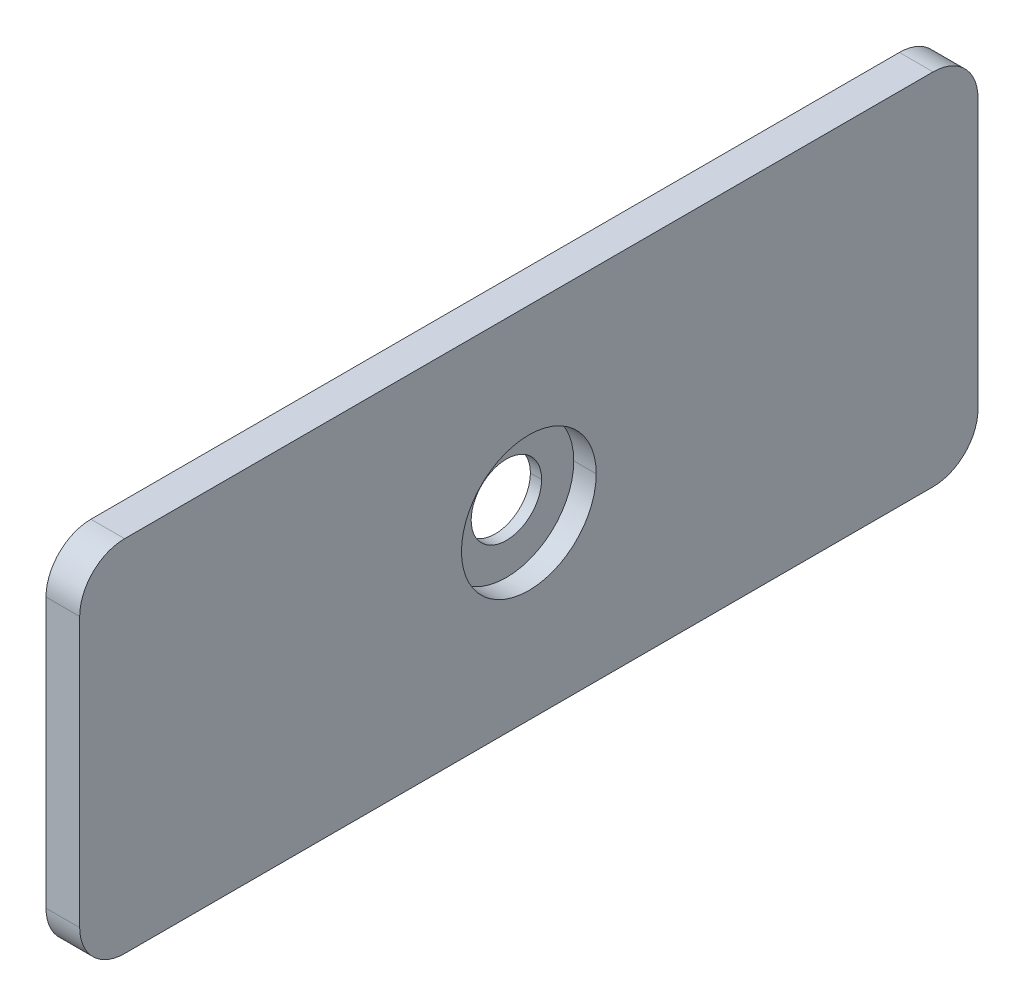
ISO-10303-21;
HEADER;
FILE_DESCRIPTION(('STEP AP214'),'2;1');
FILE_NAME('part.step','',(''),(''),'','','');
FILE_SCHEMA(('AUTOMOTIVE_DESIGN { 1 0 10303 214 1 1 1 1 }'));
ENDSEC;
DATA;
#1=APPLICATION_CONTEXT('core data for automotive mechanical design processes');
#2=APPLICATION_PROTOCOL_DEFINITION('international standard','automotive_design',2000,#1);
#3=PRODUCT_CONTEXT('',#1,'mechanical');
#4=PRODUCT('Part','Part','',(#3));
#5=PRODUCT_RELATED_PRODUCT_CATEGORY('part','',(#4));
#6=PRODUCT_DEFINITION_FORMATION('','',#4);
#7=PRODUCT_DEFINITION_CONTEXT('part definition',#1,'design');
#8=PRODUCT_DEFINITION('design','',#6,#7);
#9=PRODUCT_DEFINITION_SHAPE('','',#8);
#10=(LENGTH_UNIT() NAMED_UNIT(*) SI_UNIT(.MILLI.,.METRE.));
#11=(NAMED_UNIT(*) PLANE_ANGLE_UNIT() SI_UNIT($,.RADIAN.));
#12=(NAMED_UNIT(*) SI_UNIT($,.STERADIAN.) SOLID_ANGLE_UNIT());
#13=UNCERTAINTY_MEASURE_WITH_UNIT(LENGTH_MEASURE(1.E-05),#10,'distance_accuracy_value','');
#14=(GEOMETRIC_REPRESENTATION_CONTEXT(3) GLOBAL_UNCERTAINTY_ASSIGNED_CONTEXT((#13)) GLOBAL_UNIT_ASSIGNED_CONTEXT((#10,
#11,#12)) REPRESENTATION_CONTEXT('',''));
#15=CARTESIAN_POINT('',(0.,0.,0.));
#16=DIRECTION('',(0.,0.,1.));
#17=DIRECTION('',(1.,0.,0.));
#18=AXIS2_PLACEMENT_3D('',#15,#16,#17);
#19=CARTESIAN_POINT('',(-0.396875,0.,0.));
#20=DIRECTION('',(1.,0.,0.));
#21=DIRECTION('',(0.,0.,-1.));
#22=AXIS2_PLACEMENT_3D('',#19,#20,#21);
#23=CYLINDRICAL_SURFACE('',#22,4.7625);
#24=DIRECTION('',(1.,0.,0.));
#25=VECTOR('',#24,1.);
#26=CARTESIAN_POINT('',(-0.396875,0.,4.7625));
#27=LINE('',#26,#25);
#28=CARTESIAN_POINT('',(-0.396875,0.,4.7625));
#29=VERTEX_POINT('',#28);
#30=CARTESIAN_POINT('',(1.190625,0.,4.7625));
#31=VERTEX_POINT('',#30);
#32=EDGE_CURVE('E231',#29,#31,#27,.T.);
#33=ORIENTED_EDGE('',*,*,#32,.F.);
#34=CARTESIAN_POINT('',(-0.396875,0.,0.));
#35=DIRECTION('',(1.,0.,0.));
#36=DIRECTION('',(0.,0.,-1.));
#37=AXIS2_PLACEMENT_3D('',#34,#35,#36);
#38=CIRCLE('',#37,4.7625);
#39=CARTESIAN_POINT('',(-0.396875,0.,-4.7625));
#40=VERTEX_POINT('',#39);
#41=EDGE_CURVE('E10',#40,#29,#38,.T.);
#42=ORIENTED_EDGE('',*,*,#41,.F.);
#43=DIRECTION('',(1.,0.,0.));
#44=VECTOR('',#43,1.);
#45=CARTESIAN_POINT('',(-0.396875,0.,-4.7625));
#46=LINE('',#45,#44);
#47=CARTESIAN_POINT('',(1.190625,0.,-4.7625));
#48=VERTEX_POINT('',#47);
#49=EDGE_CURVE('E230',#40,#48,#46,.T.);
#50=ORIENTED_EDGE('',*,*,#49,.T.);
#51=CARTESIAN_POINT('',(1.190625,0.,0.));
#52=DIRECTION('',(1.,0.,0.));
#53=DIRECTION('',(0.,0.,-1.));
#54=AXIS2_PLACEMENT_3D('',#51,#52,#53);
#55=CIRCLE('',#54,4.7625);
#56=EDGE_CURVE('E180',#48,#31,#55,.T.);
#57=ORIENTED_EDGE('',*,*,#56,.T.);
#58=EDGE_LOOP('',(#33,#42,#50,#57));
#59=FACE_BOUND('',#58,.T.);
#60=ADVANCED_FACE('F15',(#59),#23,.F.);
#61=CARTESIAN_POINT('',(-0.396875,0.,0.));
#62=DIRECTION('',(1.,0.,0.));
#63=DIRECTION('',(0.,1.,0.));
#64=AXIS2_PLACEMENT_3D('',#61,#62,#63);
#65=PLANE('',#64);
#66=CARTESIAN_POINT('',(-0.396875,0.,0.));
#67=DIRECTION('',(-1.,0.,0.));
#68=DIRECTION('',(0.,0.,-1.));
#69=AXIS2_PLACEMENT_3D('',#66,#67,#68);
#70=CIRCLE('',#69,2.4892);
#71=CARTESIAN_POINT('',(-0.396875,0.,-2.4892));
#72=VERTEX_POINT('',#71);
#73=CARTESIAN_POINT('',(-0.396875,0.,2.4892));
#74=VERTEX_POINT('',#73);
#75=EDGE_CURVE('E206',#72,#74,#70,.T.);
#76=ORIENTED_EDGE('',*,*,#75,.T.);
#77=CARTESIAN_POINT('',(-0.396875,0.,0.));
#78=DIRECTION('',(-1.,0.,0.));
#79=DIRECTION('',(0.,0.,-1.));
#80=AXIS2_PLACEMENT_3D('',#77,#78,#79);
#81=CIRCLE('',#80,2.4892);
#82=EDGE_CURVE('E76',#74,#72,#81,.T.);
#83=ORIENTED_EDGE('',*,*,#82,.T.);
#84=EDGE_LOOP('',(#76,#83));
#85=FACE_BOUND('',#84,.T.);
#86=ORIENTED_EDGE('',*,*,#41,.T.);
#87=CARTESIAN_POINT('',(-0.396875,0.,0.));
#88=DIRECTION('',(1.,0.,0.));
#89=DIRECTION('',(0.,0.,-1.));
#90=AXIS2_PLACEMENT_3D('',#87,#88,#89);
#91=CIRCLE('',#90,4.7625);
#92=EDGE_CURVE('E238',#29,#40,#91,.T.);
#93=ORIENTED_EDGE('',*,*,#92,.T.);
#94=EDGE_LOOP('',(#86,#93));
#95=FACE_BOUND('',#94,.T.);
#96=ADVANCED_FACE('F355',(#85,#95),#65,.T.);
#97=CARTESIAN_POINT('',(1.190625,9.525,28.575));
#98=DIRECTION('',(-1.,0.,0.));
#99=DIRECTION('',(0.,0.,1.));
#100=AXIS2_PLACEMENT_3D('',#97,#98,#99);
#101=CYLINDRICAL_SURFACE('',#100,3.175);
#102=CARTESIAN_POINT('',(1.190625,9.525,28.575));
#103=DIRECTION('',(1.,0.,0.));
#104=DIRECTION('',(0.,0.,1.));
#105=AXIS2_PLACEMENT_3D('',#102,#103,#104);
#106=CIRCLE('',#105,3.175);
#107=CARTESIAN_POINT('',(1.190625,12.7,28.575));
#108=VERTEX_POINT('',#107);
#109=CARTESIAN_POINT('',(1.190625,9.525,31.75));
#110=VERTEX_POINT('',#109);
#111=EDGE_CURVE('E141',#108,#110,#106,.T.);
#112=ORIENTED_EDGE('',*,*,#111,.F.);
#113=DIRECTION('',(1.,0.,0.));
#114=VECTOR('',#113,1.);
#115=CARTESIAN_POINT('',(1.190625,12.7,28.575));
#116=LINE('',#115,#114);
#117=CARTESIAN_POINT('',(-1.190625,12.7,28.575));
#118=VERTEX_POINT('',#117);
#119=EDGE_CURVE('E225',#118,#108,#116,.T.);
#120=ORIENTED_EDGE('',*,*,#119,.F.);
#121=CARTESIAN_POINT('',(-1.190625,9.525,28.575));
#122=DIRECTION('',(-1.,0.,0.));
#123=DIRECTION('',(0.,0.,1.));
#124=AXIS2_PLACEMENT_3D('',#121,#122,#123);
#125=CIRCLE('',#124,3.175);
#126=CARTESIAN_POINT('',(-1.190625,9.525,31.75));
#127=VERTEX_POINT('',#126);
#128=EDGE_CURVE('E159',#127,#118,#125,.T.);
#129=ORIENTED_EDGE('',*,*,#128,.F.);
#130=DIRECTION('',(-1.,0.,0.));
#131=VECTOR('',#130,1.);
#132=CARTESIAN_POINT('',(1.190625,9.525,31.75));
#133=LINE('',#132,#131);
#134=EDGE_CURVE('E157',#110,#127,#133,.T.);
#135=ORIENTED_EDGE('',*,*,#134,.F.);
#136=EDGE_LOOP('',(#112,#120,#129,#135));
#137=FACE_BOUND('',#136,.T.);
#138=ADVANCED_FACE('F158',(#137),#101,.T.);
#139=CARTESIAN_POINT('',(1.190625,9.525,-28.575));
#140=DIRECTION('',(-1.,0.,0.));
#141=DIRECTION('',(0.,0.,1.));
#142=AXIS2_PLACEMENT_3D('',#139,#140,#141);
#143=CYLINDRICAL_SURFACE('',#142,3.175);
#144=CARTESIAN_POINT('',(1.190625,9.525,-28.575));
#145=DIRECTION('',(1.,0.,0.));
#146=DIRECTION('',(0.,0.,1.));
#147=AXIS2_PLACEMENT_3D('',#144,#145,#146);
#148=CIRCLE('',#147,3.175);
#149=CARTESIAN_POINT('',(1.190625,9.525,-31.75));
#150=VERTEX_POINT('',#149);
#151=CARTESIAN_POINT('',(1.190625,12.7,-28.575));
#152=VERTEX_POINT('',#151);
#153=EDGE_CURVE('E154',#150,#152,#148,.T.);
#154=ORIENTED_EDGE('',*,*,#153,.F.);
#155=DIRECTION('',(1.,0.,0.));
#156=VECTOR('',#155,1.);
#157=CARTESIAN_POINT('',(1.190625,9.525,-31.75));
#158=LINE('',#157,#156);
#159=CARTESIAN_POINT('',(-1.190625,9.525,-31.75));
#160=VERTEX_POINT('',#159);
#161=EDGE_CURVE('E256',#160,#150,#158,.T.);
#162=ORIENTED_EDGE('',*,*,#161,.F.);
#163=CARTESIAN_POINT('',(-1.190625,9.525,-28.575));
#164=DIRECTION('',(-1.,0.,0.));
#165=DIRECTION('',(0.,0.,1.));
#166=AXIS2_PLACEMENT_3D('',#163,#164,#165);
#167=CIRCLE('',#166,3.175);
#168=CARTESIAN_POINT('',(-1.190625,12.7,-28.575));
#169=VERTEX_POINT('',#168);
#170=EDGE_CURVE('E26',#169,#160,#167,.T.);
#171=ORIENTED_EDGE('',*,*,#170,.F.);
#172=DIRECTION('',(-1.,0.,0.));
#173=VECTOR('',#172,1.);
#174=CARTESIAN_POINT('',(1.190625,12.7,-28.575));
#175=LINE('',#174,#173);
#176=EDGE_CURVE('E217',#152,#169,#175,.T.);
#177=ORIENTED_EDGE('',*,*,#176,.F.);
#178=EDGE_LOOP('',(#154,#162,#171,#177));
#179=FACE_BOUND('',#178,.T.);
#180=ADVANCED_FACE('F305',(#179),#143,.T.);
#181=CARTESIAN_POINT('',(1.190625,-9.525,28.575));
#182=DIRECTION('',(-1.,0.,0.));
#183=DIRECTION('',(0.,0.,1.));
#184=AXIS2_PLACEMENT_3D('',#181,#182,#183);
#185=CYLINDRICAL_SURFACE('',#184,3.175);
#186=CARTESIAN_POINT('',(1.190625,-9.525,28.575));
#187=DIRECTION('',(1.,0.,0.));
#188=DIRECTION('',(0.,0.,1.));
#189=AXIS2_PLACEMENT_3D('',#186,#187,#188);
#190=CIRCLE('',#189,3.175);
#191=CARTESIAN_POINT('',(1.190625,-9.525,31.75));
#192=VERTEX_POINT('',#191);
#193=CARTESIAN_POINT('',(1.190625,-12.7,28.575));
#194=VERTEX_POINT('',#193);
#195=EDGE_CURVE('E41',#192,#194,#190,.T.);
#196=ORIENTED_EDGE('',*,*,#195,.F.);
#197=DIRECTION('',(1.,0.,0.));
#198=VECTOR('',#197,1.);
#199=CARTESIAN_POINT('',(1.190625,-9.525,31.75));
#200=LINE('',#199,#198);
#201=CARTESIAN_POINT('',(-1.190625,-9.525,31.75));
#202=VERTEX_POINT('',#201);
#203=EDGE_CURVE('E167',#202,#192,#200,.T.);
#204=ORIENTED_EDGE('',*,*,#203,.F.);
#205=CARTESIAN_POINT('',(-1.190625,-9.525,28.575));
#206=DIRECTION('',(-1.,0.,0.));
#207=DIRECTION('',(0.,0.,1.));
#208=AXIS2_PLACEMENT_3D('',#205,#206,#207);
#209=CIRCLE('',#208,3.175);
#210=CARTESIAN_POINT('',(-1.190625,-12.7,28.575));
#211=VERTEX_POINT('',#210);
#212=EDGE_CURVE('E133',#211,#202,#209,.T.);
#213=ORIENTED_EDGE('',*,*,#212,.F.);
#214=DIRECTION('',(-1.,0.,0.));
#215=VECTOR('',#214,1.);
#216=CARTESIAN_POINT('',(1.190625,-12.7,28.575));
#217=LINE('',#216,#215);
#218=EDGE_CURVE('E185',#194,#211,#217,.T.);
#219=ORIENTED_EDGE('',*,*,#218,.F.);
#220=EDGE_LOOP('',(#196,#204,#213,#219));
#221=FACE_BOUND('',#220,.T.);
#222=ADVANCED_FACE('F294',(#221),#185,.T.);
#223=CARTESIAN_POINT('',(1.190625,-9.525,-28.575));
#224=DIRECTION('',(-1.,0.,0.));
#225=DIRECTION('',(0.,0.,1.));
#226=AXIS2_PLACEMENT_3D('',#223,#224,#225);
#227=CYLINDRICAL_SURFACE('',#226,3.175);
#228=CARTESIAN_POINT('',(1.190625,-9.525,-28.575));
#229=DIRECTION('',(1.,0.,0.));
#230=DIRECTION('',(0.,0.,1.));
#231=AXIS2_PLACEMENT_3D('',#228,#229,#230);
#232=CIRCLE('',#231,3.175);
#233=CARTESIAN_POINT('',(1.190625,-12.7,-28.575));
#234=VERTEX_POINT('',#233);
#235=CARTESIAN_POINT('',(1.190625,-9.525,-31.75));
#236=VERTEX_POINT('',#235);
#237=EDGE_CURVE('E187',#234,#236,#232,.T.);
#238=ORIENTED_EDGE('',*,*,#237,.F.);
#239=DIRECTION('',(1.,0.,0.));
#240=VECTOR('',#239,1.);
#241=CARTESIAN_POINT('',(1.190625,-12.7,-28.575));
#242=LINE('',#241,#240);
#243=CARTESIAN_POINT('',(-1.190625,-12.7,-28.575));
#244=VERTEX_POINT('',#243);
#245=EDGE_CURVE('E222',#244,#234,#242,.T.);
#246=ORIENTED_EDGE('',*,*,#245,.F.);
#247=CARTESIAN_POINT('',(-1.190625,-9.525,-28.575));
#248=DIRECTION('',(-1.,0.,0.));
#249=DIRECTION('',(0.,0.,1.));
#250=AXIS2_PLACEMENT_3D('',#247,#248,#249);
#251=CIRCLE('',#250,3.175);
#252=CARTESIAN_POINT('',(-1.190625,-9.525,-31.75));
#253=VERTEX_POINT('',#252);
#254=EDGE_CURVE('E182',#253,#244,#251,.T.);
#255=ORIENTED_EDGE('',*,*,#254,.F.);
#256=DIRECTION('',(-1.,0.,0.));
#257=VECTOR('',#256,1.);
#258=CARTESIAN_POINT('',(1.190625,-9.525,-31.75));
#259=LINE('',#258,#257);
#260=EDGE_CURVE('E196',#236,#253,#259,.T.);
#261=ORIENTED_EDGE('',*,*,#260,.F.);
#262=EDGE_LOOP('',(#238,#246,#255,#261));
#263=FACE_BOUND('',#262,.T.);
#264=ADVANCED_FACE('F302',(#263),#227,.T.);
#265=CARTESIAN_POINT('',(-1.190625,0.,0.));
#266=DIRECTION('',(-1.,0.,0.));
#267=DIRECTION('',(0.,0.,1.));
#268=AXIS2_PLACEMENT_3D('',#265,#266,#267);
#269=PLANE('',#268);
#270=CARTESIAN_POINT('',(-1.190625,0.,0.));
#271=DIRECTION('',(1.,0.,0.));
#272=DIRECTION('',(0.,0.,-1.));
#273=AXIS2_PLACEMENT_3D('',#270,#271,#272);
#274=CIRCLE('',#273,2.4892);
#275=CARTESIAN_POINT('',(-1.190625,0.,-2.4892));
#276=VERTEX_POINT('',#275);
#277=CARTESIAN_POINT('',(-1.190625,0.,2.4892));
#278=VERTEX_POINT('',#277);
#279=EDGE_CURVE('E19',#276,#278,#274,.T.);
#280=ORIENTED_EDGE('',*,*,#279,.T.);
#281=CARTESIAN_POINT('',(-1.190625,0.,0.));
#282=DIRECTION('',(1.,0.,0.));
#283=DIRECTION('',(0.,0.,-1.));
#284=AXIS2_PLACEMENT_3D('',#281,#282,#283);
#285=CIRCLE('',#284,2.4892);
#286=EDGE_CURVE('E247',#278,#276,#285,.T.);
#287=ORIENTED_EDGE('',*,*,#286,.T.);
#288=EDGE_LOOP('',(#280,#287));
#289=FACE_BOUND('',#288,.T.);
#290=DIRECTION('',(0.,1.,0.));
#291=VECTOR('',#290,1.);
#292=CARTESIAN_POINT('',(-1.190625,-12.7,-31.75));
#293=LINE('',#292,#291);
#294=EDGE_CURVE('E235',#253,#160,#293,.T.);
#295=ORIENTED_EDGE('',*,*,#294,.F.);
#296=ORIENTED_EDGE('',*,*,#254,.T.);
#297=DIRECTION('',(0.,0.,-1.));
#298=VECTOR('',#297,1.);
#299=CARTESIAN_POINT('',(-1.190625,-12.7,31.75));
#300=LINE('',#299,#298);
#301=EDGE_CURVE('E164',#211,#244,#300,.T.);
#302=ORIENTED_EDGE('',*,*,#301,.F.);
#303=ORIENTED_EDGE('',*,*,#212,.T.);
#304=DIRECTION('',(0.,-1.,0.));
#305=VECTOR('',#304,1.);
#306=CARTESIAN_POINT('',(-1.190625,-12.7,31.75));
#307=LINE('',#306,#305);
#308=EDGE_CURVE('E175',#127,#202,#307,.T.);
#309=ORIENTED_EDGE('',*,*,#308,.F.);
#310=ORIENTED_EDGE('',*,*,#128,.T.);
#311=DIRECTION('',(0.,0.,1.));
#312=VECTOR('',#311,1.);
#313=CARTESIAN_POINT('',(-1.190625,12.7,31.75));
#314=LINE('',#313,#312);
#315=EDGE_CURVE('E179',#169,#118,#314,.T.);
#316=ORIENTED_EDGE('',*,*,#315,.F.);
#317=ORIENTED_EDGE('',*,*,#170,.T.);
#318=EDGE_LOOP('',(#295,#296,#302,#303,#309,#310,#316,#317));
#319=FACE_BOUND('',#318,.T.);
#320=ADVANCED_FACE('F291',(#289,#319),#269,.T.);
#321=CARTESIAN_POINT('',(1.190625,0.,0.));
#322=DIRECTION('',(-1.,0.,0.));
#323=DIRECTION('',(0.,0.,1.));
#324=AXIS2_PLACEMENT_3D('',#321,#322,#323);
#325=PLANE('',#324);
#326=ORIENTED_EDGE('',*,*,#56,.F.);
#327=CARTESIAN_POINT('',(1.190625,0.,0.));
#328=DIRECTION('',(1.,0.,0.));
#329=DIRECTION('',(0.,0.,-1.));
#330=AXIS2_PLACEMENT_3D('',#327,#328,#329);
#331=CIRCLE('',#330,4.7625);
#332=EDGE_CURVE('E226',#31,#48,#331,.T.);
#333=ORIENTED_EDGE('',*,*,#332,.F.);
#334=EDGE_LOOP('',(#326,#333));
#335=FACE_BOUND('',#334,.T.);
#336=DIRECTION('',(0.,0.,-1.));
#337=VECTOR('',#336,1.);
#338=CARTESIAN_POINT('',(1.190625,-12.7,31.75));
#339=LINE('',#338,#337);
#340=EDGE_CURVE('E188',#194,#234,#339,.T.);
#341=ORIENTED_EDGE('',*,*,#340,.T.);
#342=ORIENTED_EDGE('',*,*,#237,.T.);
#343=DIRECTION('',(0.,1.,0.));
#344=VECTOR('',#343,1.);
#345=CARTESIAN_POINT('',(1.190625,-12.7,-31.75));
#346=LINE('',#345,#344);
#347=EDGE_CURVE('E190',#236,#150,#346,.T.);
#348=ORIENTED_EDGE('',*,*,#347,.T.);
#349=ORIENTED_EDGE('',*,*,#153,.T.);
#350=DIRECTION('',(0.,0.,1.));
#351=VECTOR('',#350,1.);
#352=CARTESIAN_POINT('',(1.190625,12.7,31.75));
#353=LINE('',#352,#351);
#354=EDGE_CURVE('E149',#152,#108,#353,.T.);
#355=ORIENTED_EDGE('',*,*,#354,.T.);
#356=ORIENTED_EDGE('',*,*,#111,.T.);
#357=DIRECTION('',(0.,-1.,0.));
#358=VECTOR('',#357,1.);
#359=CARTESIAN_POINT('',(1.190625,-12.7,31.75));
#360=LINE('',#359,#358);
#361=EDGE_CURVE('E145',#110,#192,#360,.T.);
#362=ORIENTED_EDGE('',*,*,#361,.T.);
#363=ORIENTED_EDGE('',*,*,#195,.T.);
#364=EDGE_LOOP('',(#341,#342,#348,#349,#355,#356,#362,#363));
#365=FACE_BOUND('',#364,.T.);
#366=ADVANCED_FACE('F143',(#335,#365),#325,.F.);
#367=CARTESIAN_POINT('',(1.190625,-12.7,31.75));
#368=DIRECTION('',(0.,1.,0.));
#369=DIRECTION('',(1.,0.,0.));
#370=AXIS2_PLACEMENT_3D('',#367,#368,#369);
#371=PLANE('',#370);
#372=ORIENTED_EDGE('',*,*,#301,.T.);
#373=ORIENTED_EDGE('',*,*,#245,.T.);
#374=ORIENTED_EDGE('',*,*,#340,.F.);
#375=ORIENTED_EDGE('',*,*,#218,.T.);
#376=EDGE_LOOP('',(#372,#373,#374,#375));
#377=FACE_BOUND('',#376,.T.);
#378=ADVANCED_FACE('F297',(#377),#371,.F.);
#379=CARTESIAN_POINT('',(1.190625,-12.7,31.75));
#380=DIRECTION('',(0.,0.,-1.));
#381=DIRECTION('',(0.,-1.,0.));
#382=AXIS2_PLACEMENT_3D('',#379,#380,#381);
#383=PLANE('',#382);
#384=ORIENTED_EDGE('',*,*,#308,.T.);
#385=ORIENTED_EDGE('',*,*,#203,.T.);
#386=ORIENTED_EDGE('',*,*,#361,.F.);
#387=ORIENTED_EDGE('',*,*,#134,.T.);
#388=EDGE_LOOP('',(#384,#385,#386,#387));
#389=FACE_BOUND('',#388,.T.);
#390=ADVANCED_FACE('F166',(#389),#383,.F.);
#391=CARTESIAN_POINT('',(1.190625,12.7,31.75));
#392=DIRECTION('',(0.,-1.,0.));
#393=DIRECTION('',(0.,0.,-1.));
#394=AXIS2_PLACEMENT_3D('',#391,#392,#393);
#395=PLANE('',#394);
#396=ORIENTED_EDGE('',*,*,#354,.F.);
#397=ORIENTED_EDGE('',*,*,#176,.T.);
#398=ORIENTED_EDGE('',*,*,#315,.T.);
#399=ORIENTED_EDGE('',*,*,#119,.T.);
#400=EDGE_LOOP('',(#396,#397,#398,#399));
#401=FACE_BOUND('',#400,.T.);
#402=ADVANCED_FACE('F287',(#401),#395,.F.);
#403=CARTESIAN_POINT('',(1.190625,-12.7,-31.75));
#404=DIRECTION('',(0.,0.,1.));
#405=DIRECTION('',(1.,0.,0.));
#406=AXIS2_PLACEMENT_3D('',#403,#404,#405);
#407=PLANE('',#406);
#408=ORIENTED_EDGE('',*,*,#347,.F.);
#409=ORIENTED_EDGE('',*,*,#260,.T.);
#410=ORIENTED_EDGE('',*,*,#294,.T.);
#411=ORIENTED_EDGE('',*,*,#161,.T.);
#412=EDGE_LOOP('',(#408,#409,#410,#411));
#413=FACE_BOUND('',#412,.T.);
#414=ADVANCED_FACE('F17',(#413),#407,.F.);
#415=CARTESIAN_POINT('',(-1.190625,0.,0.));
#416=DIRECTION('',(1.,0.,0.));
#417=DIRECTION('',(0.,0.,-1.));
#418=AXIS2_PLACEMENT_3D('',#415,#416,#417);
#419=CYLINDRICAL_SURFACE('',#418,2.4892);
#420=DIRECTION('',(1.,0.,0.));
#421=VECTOR('',#420,1.);
#422=CARTESIAN_POINT('',(-1.190625,0.,2.4892));
#423=LINE('',#422,#421);
#424=EDGE_CURVE('E214',#278,#74,#423,.T.);
#425=ORIENTED_EDGE('',*,*,#424,.F.);
#426=ORIENTED_EDGE('',*,*,#279,.F.);
#427=DIRECTION('',(1.,0.,0.));
#428=VECTOR('',#427,1.);
#429=CARTESIAN_POINT('',(-1.190625,0.,-2.4892));
#430=LINE('',#429,#428);
#431=EDGE_CURVE('E199',#276,#72,#430,.T.);
#432=ORIENTED_EDGE('',*,*,#431,.T.);
#433=ORIENTED_EDGE('',*,*,#82,.F.);
#434=EDGE_LOOP('',(#425,#426,#432,#433));
#435=FACE_BOUND('',#434,.T.);
#436=ADVANCED_FACE('F328',(#435),#419,.F.);
#437=CARTESIAN_POINT('',(-1.190625,0.,0.));
#438=DIRECTION('',(1.,0.,0.));
#439=DIRECTION('',(0.,0.,-1.));
#440=AXIS2_PLACEMENT_3D('',#437,#438,#439);
#441=CYLINDRICAL_SURFACE('',#440,2.4892);
#442=ORIENTED_EDGE('',*,*,#286,.F.);
#443=ORIENTED_EDGE('',*,*,#424,.T.);
#444=ORIENTED_EDGE('',*,*,#75,.F.);
#445=ORIENTED_EDGE('',*,*,#431,.F.);
#446=EDGE_LOOP('',(#442,#443,#444,#445));
#447=FACE_BOUND('',#446,.T.);
#448=ADVANCED_FACE('F343',(#447),#441,.F.);
#449=CARTESIAN_POINT('',(-0.396875,0.,0.));
#450=DIRECTION('',(1.,0.,0.));
#451=DIRECTION('',(0.,0.,-1.));
#452=AXIS2_PLACEMENT_3D('',#449,#450,#451);
#453=CYLINDRICAL_SURFACE('',#452,4.7625);
#454=ORIENTED_EDGE('',*,*,#92,.F.);
#455=ORIENTED_EDGE('',*,*,#32,.T.);
#456=ORIENTED_EDGE('',*,*,#332,.T.);
#457=ORIENTED_EDGE('',*,*,#49,.F.);
#458=EDGE_LOOP('',(#454,#455,#456,#457));
#459=FACE_BOUND('',#458,.T.);
#460=ADVANCED_FACE('F347',(#459),#453,.F.);
#461=CLOSED_SHELL('',(#60,#96,#138,#180,#222,#264,#320,#366,#378,#390,#402,#414,#436,#448,#460));
#462=MANIFOLD_SOLID_BREP('B1',#461);
#463=ADVANCED_BREP_SHAPE_REPRESENTATION('',(#18,#462),#14);
#464=SHAPE_DEFINITION_REPRESENTATION(#9,#463);
ENDSEC;
END-ISO-10303-21;
